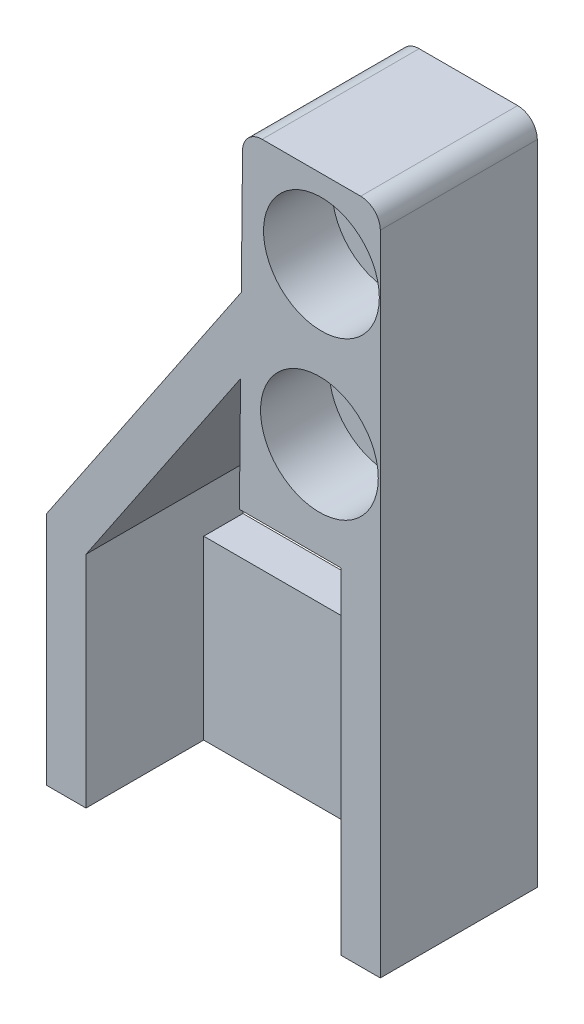
ISO-10303-21;
HEADER;
FILE_DESCRIPTION(('STEP AP214'),'2;1');
FILE_NAME('part.step','',(''),(''),'','','');
FILE_SCHEMA(('AUTOMOTIVE_DESIGN { 1 0 10303 214 1 1 1 1 }'));
ENDSEC;
DATA;
#1=APPLICATION_CONTEXT('core data for automotive mechanical design processes');
#2=APPLICATION_PROTOCOL_DEFINITION('international standard','automotive_design',2000,#1);
#3=PRODUCT_CONTEXT('',#1,'mechanical');
#4=PRODUCT('Part','Part','',(#3));
#5=PRODUCT_RELATED_PRODUCT_CATEGORY('part','',(#4));
#6=PRODUCT_DEFINITION_FORMATION('','',#4);
#7=PRODUCT_DEFINITION_CONTEXT('part definition',#1,'design');
#8=PRODUCT_DEFINITION('design','',#6,#7);
#9=PRODUCT_DEFINITION_SHAPE('','',#8);
#10=(LENGTH_UNIT() NAMED_UNIT(*) SI_UNIT(.MILLI.,.METRE.));
#11=(NAMED_UNIT(*) PLANE_ANGLE_UNIT() SI_UNIT($,.RADIAN.));
#12=(NAMED_UNIT(*) SI_UNIT($,.STERADIAN.) SOLID_ANGLE_UNIT());
#13=UNCERTAINTY_MEASURE_WITH_UNIT(LENGTH_MEASURE(1.E-05),#10,'distance_accuracy_value','');
#14=(GEOMETRIC_REPRESENTATION_CONTEXT(3) GLOBAL_UNCERTAINTY_ASSIGNED_CONTEXT((#13)) GLOBAL_UNIT_ASSIGNED_CONTEXT((#10,
#11,#12)) REPRESENTATION_CONTEXT('',''));
#15=CARTESIAN_POINT('',(0.,0.,0.));
#16=DIRECTION('',(0.,0.,1.));
#17=DIRECTION('',(1.,0.,0.));
#18=AXIS2_PLACEMENT_3D('',#15,#16,#17);
#19=CARTESIAN_POINT('',(3.,30.,8.));
#20=DIRECTION('',(0.,0.,-1.));
#21=DIRECTION('',(-1.,0.,0.));
#22=AXIS2_PLACEMENT_3D('',#19,#20,#21);
#23=CYLINDRICAL_SURFACE('',#22,1.6);
#24=CARTESIAN_POINT('',(3.,30.,0.));
#25=DIRECTION('',(0.,0.,1.));
#26=DIRECTION('',(1.,0.,0.));
#27=AXIS2_PLACEMENT_3D('',#24,#25,#26);
#28=CIRCLE('',#27,1.6);
#29=CARTESIAN_POINT('',(4.6,30.,0.));
#30=VERTEX_POINT('',#29);
#31=EDGE_CURVE('E225',#30,#30,#28,.T.);
#32=ORIENTED_EDGE('',*,*,#31,.F.);
#33=EDGE_LOOP('',(#32));
#34=FACE_BOUND('',#33,.T.);
#35=CARTESIAN_POINT('',(3.,30.,4.5));
#36=DIRECTION('',(0.,0.,1.));
#37=DIRECTION('',(1.,0.,0.));
#38=AXIS2_PLACEMENT_3D('',#35,#36,#37);
#39=CIRCLE('',#38,1.6);
#40=CARTESIAN_POINT('',(4.6,30.,4.5));
#41=VERTEX_POINT('',#40);
#42=EDGE_CURVE('E278',#41,#41,#39,.T.);
#43=ORIENTED_EDGE('',*,*,#42,.T.);
#44=EDGE_LOOP('',(#43));
#45=FACE_BOUND('',#44,.T.);
#46=ADVANCED_FACE('F35',(#34,#45),#23,.F.);
#47=CARTESIAN_POINT('',(2.89726379028041,22.,8.));
#48=DIRECTION('',(0.,0.,-1.));
#49=DIRECTION('',(-1.,0.,0.));
#50=AXIS2_PLACEMENT_3D('',#47,#48,#49);
#51=CYLINDRICAL_SURFACE('',#50,1.6);
#52=CARTESIAN_POINT('',(2.89726379028041,22.,0.));
#53=DIRECTION('',(0.,0.,1.));
#54=DIRECTION('',(1.,0.,0.));
#55=AXIS2_PLACEMENT_3D('',#52,#53,#54);
#56=CIRCLE('',#55,1.6);
#57=CARTESIAN_POINT('',(4.49726379028041,22.,0.));
#58=VERTEX_POINT('',#57);
#59=EDGE_CURVE('E228',#58,#58,#56,.T.);
#60=ORIENTED_EDGE('',*,*,#59,.F.);
#61=EDGE_LOOP('',(#60));
#62=FACE_BOUND('',#61,.T.);
#63=CARTESIAN_POINT('',(2.89726379028041,22.,4.5));
#64=DIRECTION('',(0.,0.,1.));
#65=DIRECTION('',(1.,0.,0.));
#66=AXIS2_PLACEMENT_3D('',#63,#64,#65);
#67=CIRCLE('',#66,1.6);
#68=CARTESIAN_POINT('',(4.49726379028041,22.,4.5));
#69=VERTEX_POINT('',#68);
#70=EDGE_CURVE('E186',#69,#69,#67,.T.);
#71=ORIENTED_EDGE('',*,*,#70,.T.);
#72=EDGE_LOOP('',(#71));
#73=FACE_BOUND('',#72,.T.);
#74=ADVANCED_FACE('F331',(#62,#73),#51,.F.);
#75=CARTESIAN_POINT('',(-1.01055642635325,34.0034369178317,8.));
#76=DIRECTION('',(0.999950142321506,-0.00998563323976393,0.));
#77=DIRECTION('',(0.00998563323976393,0.999950142321506,0.));
#78=AXIS2_PLACEMENT_3D('',#75,#76,#77);
#79=PLANE('',#78);
#80=DIRECTION('',(-0.00998563323976393,-0.999950142321506,0.));
#81=VECTOR('',#80,1.);
#82=CARTESIAN_POINT('',(-1.01055642635325,34.0034369178317,8.));
#83=LINE('',#82,#81);
#84=CARTESIAN_POINT('',(-1.02044283963543,33.0134225510715,8.));
#85=VERTEX_POINT('',#84);
#86=CARTESIAN_POINT('',(-1.08330823355803,26.7181523272791,8.));
#87=VERTEX_POINT('',#86);
#88=EDGE_CURVE('E241',#85,#87,#83,.T.);
#89=ORIENTED_EDGE('',*,*,#88,.F.);
#90=DIRECTION('',(0.,0.,-1.));
#91=VECTOR('',#90,1.);
#92=CARTESIAN_POINT('',(-1.02044283963543,33.0134225510715,8.));
#93=LINE('',#92,#91);
#94=CARTESIAN_POINT('',(-1.02044283963543,33.0134225510715,0.));
#95=VERTEX_POINT('',#94);
#96=EDGE_CURVE('E11',#85,#95,#93,.T.);
#97=ORIENTED_EDGE('',*,*,#96,.T.);
#98=DIRECTION('',(-0.00998563323976393,-0.999950142321506,0.));
#99=VECTOR('',#98,1.);
#100=CARTESIAN_POINT('',(-1.01055642635325,34.0034369178317,0.));
#101=LINE('',#100,#99);
#102=CARTESIAN_POINT('',(-1.08330823355803,26.7181523272791,0.));
#103=VERTEX_POINT('',#102);
#104=EDGE_CURVE('E253',#95,#103,#101,.T.);
#105=ORIENTED_EDGE('',*,*,#104,.T.);
#106=DIRECTION('',(0.,0.,1.));
#107=VECTOR('',#106,1.);
#108=CARTESIAN_POINT('',(-1.08330823355803,26.7181523272791,0.));
#109=LINE('',#108,#107);
#110=EDGE_CURVE('E192',#103,#87,#109,.T.);
#111=ORIENTED_EDGE('',*,*,#110,.T.);
#112=EDGE_LOOP('',(#89,#97,#105,#111));
#113=FACE_BOUND('',#112,.T.);
#114=ADVANCED_FACE('F322',(#113),#79,.F.);
#115=CARTESIAN_POINT('',(0.,0.,8.));
#116=DIRECTION('',(0.,0.,-1.));
#117=DIRECTION('',(-1.,0.,0.));
#118=AXIS2_PLACEMENT_3D('',#115,#116,#117);
#119=PLANE('',#118);
#120=CARTESIAN_POINT('',(3.,30.,8.));
#121=DIRECTION('',(0.,0.,1.));
#122=DIRECTION('',(1.,0.,0.));
#123=AXIS2_PLACEMENT_3D('',#120,#121,#122);
#124=CIRCLE('',#123,2.95);
#125=CARTESIAN_POINT('',(5.95,30.,8.));
#126=VERTEX_POINT('',#125);
#127=EDGE_CURVE('E555',#126,#126,#124,.T.);
#128=ORIENTED_EDGE('',*,*,#127,.F.);
#129=EDGE_LOOP('',(#128));
#130=FACE_BOUND('',#129,.T.);
#131=CARTESIAN_POINT('',(2.89726379028041,22.,8.));
#132=DIRECTION('',(0.,0.,1.));
#133=DIRECTION('',(1.,0.,0.));
#134=AXIS2_PLACEMENT_3D('',#131,#132,#133);
#135=CIRCLE('',#134,3.);
#136=CARTESIAN_POINT('',(5.89726379028042,22.,8.));
#137=VERTEX_POINT('',#136);
#138=EDGE_CURVE('E181',#137,#137,#135,.T.);
#139=ORIENTED_EDGE('',*,*,#138,.F.);
#140=EDGE_LOOP('',(#139));
#141=FACE_BOUND('',#140,.T.);
#142=DIRECTION('',(0.,1.,0.));
#143=VECTOR('',#142,1.);
#144=CARTESIAN_POINT('',(6.,0.,8.));
#145=LINE('',#144,#143);
#146=CARTESIAN_POINT('',(6.,0.,8.));
#147=VERTEX_POINT('',#146);
#148=CARTESIAN_POINT('',(6.,33.0034369178317,8.));
#149=VERTEX_POINT('',#148);
#150=EDGE_CURVE('E235',#147,#149,#145,.T.);
#151=ORIENTED_EDGE('',*,*,#150,.T.);
#152=CARTESIAN_POINT('',(5.,33.0034369178317,8.));
#153=DIRECTION('',(0.,0.,-1.));
#154=DIRECTION('',(-1.,0.,0.));
#155=AXIS2_PLACEMENT_3D('',#152,#153,#154);
#156=CIRCLE('',#155,1.);
#157=CARTESIAN_POINT('',(5.,34.0034369178317,8.));
#158=VERTEX_POINT('',#157);
#159=EDGE_CURVE('E43',#149,#158,#156,.F.);
#160=ORIENTED_EDGE('',*,*,#159,.T.);
#161=DIRECTION('',(-1.,0.,0.));
#162=VECTOR('',#161,1.);
#163=CARTESIAN_POINT('',(0.,34.0034369178317,8.));
#164=LINE('',#163,#162);
#165=CARTESIAN_POINT('',(-0.0204926973139273,34.0034369178317,8.));
#166=VERTEX_POINT('',#165);
#167=EDGE_CURVE('E238',#158,#166,#164,.T.);
#168=ORIENTED_EDGE('',*,*,#167,.T.);
#169=CARTESIAN_POINT('',(-0.0204926973139273,33.0034369178317,8.));
#170=DIRECTION('',(0.,0.,-1.));
#171=DIRECTION('',(-1.,0.,0.));
#172=AXIS2_PLACEMENT_3D('',#169,#170,#171);
#173=CIRCLE('',#172,1.);
#174=EDGE_CURVE('E50',#166,#85,#173,.F.);
#175=ORIENTED_EDGE('',*,*,#174,.T.);
#176=ORIENTED_EDGE('',*,*,#88,.T.);
#177=DIRECTION('',(-0.558773518467853,-0.829320297025857,0.));
#178=VECTOR('',#177,1.);
#179=CARTESIAN_POINT('',(-11.,12.,8.));
#180=LINE('',#179,#178);
#181=CARTESIAN_POINT('',(-11.,12.,8.));
#182=VERTEX_POINT('',#181);
#183=EDGE_CURVE('E176',#87,#182,#180,.T.);
#184=ORIENTED_EDGE('',*,*,#183,.T.);
#185=DIRECTION('',(0.,-1.,0.));
#186=VECTOR('',#185,1.);
#187=CARTESIAN_POINT('',(-11.,0.,8.));
#188=LINE('',#187,#186);
#189=CARTESIAN_POINT('',(-11.,0.,8.));
#190=VERTEX_POINT('',#189);
#191=EDGE_CURVE('E243',#182,#190,#188,.T.);
#192=ORIENTED_EDGE('',*,*,#191,.T.);
#193=DIRECTION('',(1.,0.,0.));
#194=VECTOR('',#193,1.);
#195=CARTESIAN_POINT('',(0.,0.,8.));
#196=LINE('',#195,#194);
#197=CARTESIAN_POINT('',(-8.99817146185961,0.,8.));
#198=VERTEX_POINT('',#197);
#199=EDGE_CURVE('E232',#190,#198,#196,.T.);
#200=ORIENTED_EDGE('',*,*,#199,.T.);
#201=DIRECTION('',(0.,-1.,0.));
#202=VECTOR('',#201,1.);
#203=CARTESIAN_POINT('',(-8.99817146185961,0.,8.));
#204=LINE('',#203,#202);
#205=CARTESIAN_POINT('',(-8.99817146185961,11.2012197421227,8.));
#206=VERTEX_POINT('',#205);
#207=EDGE_CURVE('E191',#206,#198,#204,.T.);
#208=ORIENTED_EDGE('',*,*,#207,.F.);
#209=DIRECTION('',(0.558773518467853,0.829320297025858,0.));
#210=VECTOR('',#209,1.);
#211=CARTESIAN_POINT('',(-1.12152084193054,22.8915844709306,8.));
#212=LINE('',#211,#210);
#213=CARTESIAN_POINT('',(-1.12152084193054,22.8915844709306,8.));
#214=VERTEX_POINT('',#213);
#215=EDGE_CURVE('E157',#206,#214,#212,.T.);
#216=ORIENTED_EDGE('',*,*,#215,.T.);
#217=CARTESIAN_POINT('',(-1.17940341998797,17.0952878539086,8.));
#218=VERTEX_POINT('',#217);
#219=EDGE_CURVE('E240',#214,#218,#83,.T.);
#220=ORIENTED_EDGE('',*,*,#219,.T.);
#221=DIRECTION('',(-1.,0.,0.));
#222=VECTOR('',#221,1.);
#223=CARTESIAN_POINT('',(-8.99817146185961,17.0952878539086,8.));
#224=LINE('',#223,#222);
#225=CARTESIAN_POINT('',(4.00182853814039,17.0952878539086,8.));
#226=VERTEX_POINT('',#225);
#227=EDGE_CURVE('E200',#226,#218,#224,.T.);
#228=ORIENTED_EDGE('',*,*,#227,.F.);
#229=DIRECTION('',(0.,1.,0.));
#230=VECTOR('',#229,1.);
#231=CARTESIAN_POINT('',(4.00182853814039,0.,8.));
#232=LINE('',#231,#230);
#233=CARTESIAN_POINT('',(4.00182853814039,0.,8.));
#234=VERTEX_POINT('',#233);
#235=EDGE_CURVE('E211',#234,#226,#232,.T.);
#236=ORIENTED_EDGE('',*,*,#235,.F.);
#237=EDGE_CURVE('E236',#234,#147,#196,.T.);
#238=ORIENTED_EDGE('',*,*,#237,.T.);
#239=EDGE_LOOP('',(#151,#160,#168,#175,#176,#184,#192,#200,#208,#216,#220,#228,#236,#238));
#240=FACE_BOUND('',#239,.T.);
#241=ADVANCED_FACE('F293',(#130,#141,#240),#119,.F.);
#242=CARTESIAN_POINT('',(0.,0.,0.));
#243=DIRECTION('',(0.,0.,-1.));
#244=DIRECTION('',(-1.,0.,0.));
#245=AXIS2_PLACEMENT_3D('',#242,#243,#244);
#246=PLANE('',#245);
#247=DIRECTION('',(-1.,0.,0.));
#248=VECTOR('',#247,1.);
#249=CARTESIAN_POINT('',(0.,34.0034369178317,0.));
#250=LINE('',#249,#248);
#251=CARTESIAN_POINT('',(5.,34.0034369178317,0.));
#252=VERTEX_POINT('',#251);
#253=CARTESIAN_POINT('',(-0.0204926973139273,34.0034369178317,0.));
#254=VERTEX_POINT('',#253);
#255=EDGE_CURVE('E250',#252,#254,#250,.T.);
#256=ORIENTED_EDGE('',*,*,#255,.F.);
#257=CARTESIAN_POINT('',(5.,33.0034369178317,0.));
#258=DIRECTION('',(0.,0.,-1.));
#259=DIRECTION('',(-1.,0.,0.));
#260=AXIS2_PLACEMENT_3D('',#257,#258,#259);
#261=CIRCLE('',#260,1.);
#262=CARTESIAN_POINT('',(6.,33.0034369178317,0.));
#263=VERTEX_POINT('',#262);
#264=EDGE_CURVE('E288',#252,#263,#261,.T.);
#265=ORIENTED_EDGE('',*,*,#264,.T.);
#266=DIRECTION('',(0.,1.,0.));
#267=VECTOR('',#266,1.);
#268=CARTESIAN_POINT('',(6.,24.,0.));
#269=LINE('',#268,#267);
#270=CARTESIAN_POINT('',(6.,0.,0.));
#271=VERTEX_POINT('',#270);
#272=EDGE_CURVE('E248',#271,#263,#269,.T.);
#273=ORIENTED_EDGE('',*,*,#272,.F.);
#274=DIRECTION('',(1.,0.,0.));
#275=VECTOR('',#274,1.);
#276=CARTESIAN_POINT('',(0.,0.,0.));
#277=LINE('',#276,#275);
#278=CARTESIAN_POINT('',(-11.,0.,0.));
#279=VERTEX_POINT('',#278);
#280=EDGE_CURVE('E231',#279,#271,#277,.T.);
#281=ORIENTED_EDGE('',*,*,#280,.F.);
#282=DIRECTION('',(0.,-1.,0.));
#283=VECTOR('',#282,1.);
#284=CARTESIAN_POINT('',(-11.,0.,0.));
#285=LINE('',#284,#283);
#286=CARTESIAN_POINT('',(-11.,12.,0.));
#287=VERTEX_POINT('',#286);
#288=EDGE_CURVE('E257',#287,#279,#285,.T.);
#289=ORIENTED_EDGE('',*,*,#288,.F.);
#290=DIRECTION('',(-0.558773518467853,-0.829320297025857,0.));
#291=VECTOR('',#290,1.);
#292=CARTESIAN_POINT('',(-11.,12.,0.));
#293=LINE('',#292,#291);
#294=EDGE_CURVE('E171',#103,#287,#293,.T.);
#295=ORIENTED_EDGE('',*,*,#294,.F.);
#296=ORIENTED_EDGE('',*,*,#104,.F.);
#297=CARTESIAN_POINT('',(-0.0204926973139273,33.0034369178317,0.));
#298=DIRECTION('',(0.,0.,-1.));
#299=DIRECTION('',(-1.,0.,0.));
#300=AXIS2_PLACEMENT_3D('',#297,#298,#299);
#301=CIRCLE('',#300,1.);
#302=EDGE_CURVE('E286',#95,#254,#301,.T.);
#303=ORIENTED_EDGE('',*,*,#302,.T.);
#304=EDGE_LOOP('',(#256,#265,#273,#281,#289,#295,#296,#303));
#305=FACE_BOUND('',#304,.T.);
#306=ORIENTED_EDGE('',*,*,#59,.T.);
#307=EDGE_LOOP('',(#306));
#308=FACE_BOUND('',#307,.T.);
#309=CARTESIAN_POINT('',(-1.12152084193054,22.8915844709306,0.));
#310=VERTEX_POINT('',#309);
#311=CARTESIAN_POINT('',(-1.26024402599236,9.,0.));
#312=VERTEX_POINT('',#311);
#313=EDGE_CURVE('E170',#310,#312,#101,.T.);
#314=ORIENTED_EDGE('',*,*,#313,.F.);
#315=DIRECTION('',(0.558773518467853,0.829320297025858,0.));
#316=VECTOR('',#315,1.);
#317=CARTESIAN_POINT('',(-1.12152084193054,22.8915844709306,0.));
#318=LINE('',#317,#316);
#319=CARTESIAN_POINT('',(-8.99817146185961,11.2012197421227,0.));
#320=VERTEX_POINT('',#319);
#321=EDGE_CURVE('E155',#320,#310,#318,.T.);
#322=ORIENTED_EDGE('',*,*,#321,.F.);
#323=DIRECTION('',(0.,1.,0.));
#324=VECTOR('',#323,1.);
#325=CARTESIAN_POINT('',(-8.99817146185961,9.,0.));
#326=LINE('',#325,#324);
#327=CARTESIAN_POINT('',(-8.99817146185961,9.,0.));
#328=VERTEX_POINT('',#327);
#329=EDGE_CURVE('E169',#328,#320,#326,.T.);
#330=ORIENTED_EDGE('',*,*,#329,.F.);
#331=DIRECTION('',(-1.,0.,0.));
#332=VECTOR('',#331,1.);
#333=CARTESIAN_POINT('',(-1.26024402599236,9.,0.));
#334=LINE('',#333,#332);
#335=EDGE_CURVE('E255',#312,#328,#334,.T.);
#336=ORIENTED_EDGE('',*,*,#335,.F.);
#337=EDGE_LOOP('',(#314,#322,#330,#336));
#338=FACE_BOUND('',#337,.T.);
#339=ORIENTED_EDGE('',*,*,#31,.T.);
#340=EDGE_LOOP('',(#339));
#341=FACE_BOUND('',#340,.T.);
#342=ADVANCED_FACE('F166',(#305,#308,#338,#341),#246,.T.);
#343=CARTESIAN_POINT('',(0.,0.,8.));
#344=DIRECTION('',(0.,1.,0.));
#345=DIRECTION('',(0.,0.,1.));
#346=AXIS2_PLACEMENT_3D('',#343,#344,#345);
#347=PLANE('',#346);
#348=DIRECTION('',(1.,0.,0.));
#349=VECTOR('',#348,1.);
#350=CARTESIAN_POINT('',(-8.99817146185961,0.,2.));
#351=LINE('',#350,#349);
#352=CARTESIAN_POINT('',(-8.99817146185961,0.,2.));
#353=VERTEX_POINT('',#352);
#354=CARTESIAN_POINT('',(4.00182853814039,0.,2.));
#355=VERTEX_POINT('',#354);
#356=EDGE_CURVE('E199',#353,#355,#351,.T.);
#357=ORIENTED_EDGE('',*,*,#356,.F.);
#358=DIRECTION('',(0.,0.,1.));
#359=VECTOR('',#358,1.);
#360=CARTESIAN_POINT('',(-8.99817146185961,0.,2.));
#361=LINE('',#360,#359);
#362=EDGE_CURVE('E209',#353,#198,#361,.T.);
#363=ORIENTED_EDGE('',*,*,#362,.T.);
#364=ORIENTED_EDGE('',*,*,#199,.F.);
#365=DIRECTION('',(0.,0.,-1.));
#366=VECTOR('',#365,1.);
#367=CARTESIAN_POINT('',(-11.,0.,8.));
#368=LINE('',#367,#366);
#369=EDGE_CURVE('E245',#190,#279,#368,.T.);
#370=ORIENTED_EDGE('',*,*,#369,.T.);
#371=ORIENTED_EDGE('',*,*,#280,.T.);
#372=DIRECTION('',(0.,0.,-1.));
#373=VECTOR('',#372,1.);
#374=CARTESIAN_POINT('',(6.,0.,8.));
#375=LINE('',#374,#373);
#376=EDGE_CURVE('E265',#147,#271,#375,.T.);
#377=ORIENTED_EDGE('',*,*,#376,.F.);
#378=ORIENTED_EDGE('',*,*,#237,.F.);
#379=DIRECTION('',(0.,0.,1.));
#380=VECTOR('',#379,1.);
#381=CARTESIAN_POINT('',(4.00182853814039,0.,2.));
#382=LINE('',#381,#380);
#383=EDGE_CURVE('E219',#355,#234,#382,.T.);
#384=ORIENTED_EDGE('',*,*,#383,.F.);
#385=EDGE_LOOP('',(#357,#363,#364,#370,#371,#377,#378,#384));
#386=FACE_BOUND('',#385,.T.);
#387=ADVANCED_FACE('F308',(#386),#347,.F.);
#388=CARTESIAN_POINT('',(6.,24.,8.));
#389=DIRECTION('',(-1.,0.,0.));
#390=DIRECTION('',(0.,0.,1.));
#391=AXIS2_PLACEMENT_3D('',#388,#389,#390);
#392=PLANE('',#391);
#393=ORIENTED_EDGE('',*,*,#272,.T.);
#394=DIRECTION('',(0.,0.,-1.));
#395=VECTOR('',#394,1.);
#396=CARTESIAN_POINT('',(6.,33.0034369178317,8.));
#397=LINE('',#396,#395);
#398=EDGE_CURVE('E58',#263,#149,#397,.F.);
#399=ORIENTED_EDGE('',*,*,#398,.T.);
#400=ORIENTED_EDGE('',*,*,#150,.F.);
#401=ORIENTED_EDGE('',*,*,#376,.T.);
#402=EDGE_LOOP('',(#393,#399,#400,#401));
#403=FACE_BOUND('',#402,.T.);
#404=ADVANCED_FACE('F303',(#403),#392,.F.);
#405=CARTESIAN_POINT('',(0.,34.0034369178317,8.));
#406=DIRECTION('',(0.,-1.,0.));
#407=DIRECTION('',(0.,0.,-1.));
#408=AXIS2_PLACEMENT_3D('',#405,#406,#407);
#409=PLANE('',#408);
#410=ORIENTED_EDGE('',*,*,#167,.F.);
#411=DIRECTION('',(0.,0.,-1.));
#412=VECTOR('',#411,1.);
#413=CARTESIAN_POINT('',(5.,34.0034369178317,8.));
#414=LINE('',#413,#412);
#415=EDGE_CURVE('E283',#158,#252,#414,.T.);
#416=ORIENTED_EDGE('',*,*,#415,.T.);
#417=ORIENTED_EDGE('',*,*,#255,.T.);
#418=DIRECTION('',(0.,0.,-1.));
#419=VECTOR('',#418,1.);
#420=CARTESIAN_POINT('',(-0.0204926973139273,34.0034369178317,8.));
#421=LINE('',#420,#419);
#422=EDGE_CURVE('E274',#254,#166,#421,.F.);
#423=ORIENTED_EDGE('',*,*,#422,.T.);
#424=EDGE_LOOP('',(#410,#416,#417,#423));
#425=FACE_BOUND('',#424,.T.);
#426=ADVANCED_FACE('F297',(#425),#409,.F.);
#427=ORIENTED_EDGE('',*,*,#219,.F.);
#428=DIRECTION('',(0.,0.,1.));
#429=VECTOR('',#428,1.);
#430=CARTESIAN_POINT('',(-1.12152084193054,22.8915844709306,0.));
#431=LINE('',#430,#429);
#432=EDGE_CURVE('E160',#310,#214,#431,.T.);
#433=ORIENTED_EDGE('',*,*,#432,.F.);
#434=ORIENTED_EDGE('',*,*,#313,.T.);
#435=DIRECTION('',(0.,0.,-1.));
#436=VECTOR('',#435,1.);
#437=CARTESIAN_POINT('',(-1.26024402599236,9.,8.));
#438=LINE('',#437,#436);
#439=CARTESIAN_POINT('',(-1.26024402599236,9.,2.));
#440=VERTEX_POINT('',#439);
#441=EDGE_CURVE('E262',#440,#312,#438,.T.);
#442=ORIENTED_EDGE('',*,*,#441,.F.);
#443=DIRECTION('',(0.00998563323976393,0.999950142321506,0.));
#444=VECTOR('',#443,1.);
#445=CARTESIAN_POINT('',(-1.01055642635325,34.0034369178317,2.));
#446=LINE('',#445,#444);
#447=CARTESIAN_POINT('',(-1.17940341998797,17.0952878539086,2.));
#448=VERTEX_POINT('',#447);
#449=EDGE_CURVE('E218',#440,#448,#446,.T.);
#450=ORIENTED_EDGE('',*,*,#449,.T.);
#451=DIRECTION('',(0.,0.,1.));
#452=VECTOR('',#451,1.);
#453=CARTESIAN_POINT('',(-1.17940341998797,17.0952878539086,8.));
#454=LINE('',#453,#452);
#455=EDGE_CURVE('E271',#448,#218,#454,.T.);
#456=ORIENTED_EDGE('',*,*,#455,.T.);
#457=EDGE_LOOP('',(#427,#433,#434,#442,#450,#456));
#458=FACE_BOUND('',#457,.T.);
#459=ADVANCED_FACE('F355',(#458),#79,.F.);
#460=CARTESIAN_POINT('',(-1.26024402599236,9.,8.));
#461=DIRECTION('',(0.,-1.,0.));
#462=DIRECTION('',(1.,0.,0.));
#463=AXIS2_PLACEMENT_3D('',#460,#461,#462);
#464=PLANE('',#463);
#465=ORIENTED_EDGE('',*,*,#335,.T.);
#466=DIRECTION('',(0.,0.,1.));
#467=VECTOR('',#466,1.);
#468=CARTESIAN_POINT('',(-8.99817146185961,9.,0.));
#469=LINE('',#468,#467);
#470=CARTESIAN_POINT('',(-8.99817146185961,9.,2.));
#471=VERTEX_POINT('',#470);
#472=EDGE_CURVE('E161',#328,#471,#469,.T.);
#473=ORIENTED_EDGE('',*,*,#472,.T.);
#474=DIRECTION('',(1.,0.,0.));
#475=VECTOR('',#474,1.);
#476=CARTESIAN_POINT('',(-1.26024402599236,9.,2.));
#477=LINE('',#476,#475);
#478=EDGE_CURVE('E268',#471,#440,#477,.T.);
#479=ORIENTED_EDGE('',*,*,#478,.T.);
#480=ORIENTED_EDGE('',*,*,#441,.T.);
#481=EDGE_LOOP('',(#465,#473,#479,#480));
#482=FACE_BOUND('',#481,.T.);
#483=ADVANCED_FACE('F352',(#482),#464,.F.);
#484=CARTESIAN_POINT('',(-11.,0.,8.));
#485=DIRECTION('',(1.,0.,0.));
#486=DIRECTION('',(0.,0.,-1.));
#487=AXIS2_PLACEMENT_3D('',#484,#485,#486);
#488=PLANE('',#487);
#489=ORIENTED_EDGE('',*,*,#288,.T.);
#490=ORIENTED_EDGE('',*,*,#369,.F.);
#491=ORIENTED_EDGE('',*,*,#191,.F.);
#492=DIRECTION('',(0.,0.,1.));
#493=VECTOR('',#492,1.);
#494=CARTESIAN_POINT('',(-11.,12.,0.));
#495=LINE('',#494,#493);
#496=EDGE_CURVE('E188',#287,#182,#495,.T.);
#497=ORIENTED_EDGE('',*,*,#496,.F.);
#498=EDGE_LOOP('',(#489,#490,#491,#497));
#499=FACE_BOUND('',#498,.T.);
#500=ADVANCED_FACE('F315',(#499),#488,.F.);
#501=CARTESIAN_POINT('',(-8.99817146185961,17.0952878539086,2.));
#502=DIRECTION('',(0.,1.,0.));
#503=DIRECTION('',(0.,0.,1.));
#504=AXIS2_PLACEMENT_3D('',#501,#502,#503);
#505=PLANE('',#504);
#506=DIRECTION('',(-1.,0.,0.));
#507=VECTOR('',#506,1.);
#508=CARTESIAN_POINT('',(-8.99817146185961,17.0952878539086,2.));
#509=LINE('',#508,#507);
#510=CARTESIAN_POINT('',(4.00182853814039,17.0952878539086,2.));
#511=VERTEX_POINT('',#510);
#512=EDGE_CURVE('E206',#511,#448,#509,.T.);
#513=ORIENTED_EDGE('',*,*,#512,.F.);
#514=DIRECTION('',(0.,0.,1.));
#515=VECTOR('',#514,1.);
#516=CARTESIAN_POINT('',(4.00182853814039,17.0952878539086,2.));
#517=LINE('',#516,#515);
#518=EDGE_CURVE('E216',#511,#226,#517,.T.);
#519=ORIENTED_EDGE('',*,*,#518,.T.);
#520=ORIENTED_EDGE('',*,*,#227,.T.);
#521=ORIENTED_EDGE('',*,*,#455,.F.);
#522=EDGE_LOOP('',(#513,#519,#520,#521));
#523=FACE_BOUND('',#522,.T.);
#524=ADVANCED_FACE('F351',(#523),#505,.F.);
#525=CARTESIAN_POINT('',(-8.99817146185961,0.,2.));
#526=DIRECTION('',(-1.,0.,0.));
#527=DIRECTION('',(0.,0.,1.));
#528=AXIS2_PLACEMENT_3D('',#525,#526,#527);
#529=PLANE('',#528);
#530=ORIENTED_EDGE('',*,*,#207,.T.);
#531=ORIENTED_EDGE('',*,*,#362,.F.);
#532=DIRECTION('',(0.,-1.,0.));
#533=VECTOR('',#532,1.);
#534=CARTESIAN_POINT('',(-8.99817146185961,0.,2.));
#535=LINE('',#534,#533);
#536=EDGE_CURVE('E197',#471,#353,#535,.T.);
#537=ORIENTED_EDGE('',*,*,#536,.F.);
#538=ORIENTED_EDGE('',*,*,#472,.F.);
#539=ORIENTED_EDGE('',*,*,#329,.T.);
#540=DIRECTION('',(0.,0.,1.));
#541=VECTOR('',#540,1.);
#542=CARTESIAN_POINT('',(-8.99817146185961,11.2012197421227,0.));
#543=LINE('',#542,#541);
#544=EDGE_CURVE('E151',#320,#206,#543,.T.);
#545=ORIENTED_EDGE('',*,*,#544,.T.);
#546=EDGE_LOOP('',(#530,#531,#537,#538,#539,#545));
#547=FACE_BOUND('',#546,.T.);
#548=ADVANCED_FACE('F174',(#547),#529,.F.);
#549=CARTESIAN_POINT('',(0.,0.,2.));
#550=DIRECTION('',(0.,0.,-1.));
#551=DIRECTION('',(-1.,0.,0.));
#552=AXIS2_PLACEMENT_3D('',#549,#550,#551);
#553=PLANE('',#552);
#554=ORIENTED_EDGE('',*,*,#478,.F.);
#555=ORIENTED_EDGE('',*,*,#536,.T.);
#556=ORIENTED_EDGE('',*,*,#356,.T.);
#557=DIRECTION('',(0.,1.,0.));
#558=VECTOR('',#557,1.);
#559=CARTESIAN_POINT('',(4.00182853814039,0.,2.));
#560=LINE('',#559,#558);
#561=EDGE_CURVE('E203',#355,#511,#560,.T.);
#562=ORIENTED_EDGE('',*,*,#561,.T.);
#563=ORIENTED_EDGE('',*,*,#512,.T.);
#564=ORIENTED_EDGE('',*,*,#449,.F.);
#565=EDGE_LOOP('',(#554,#555,#556,#562,#563,#564));
#566=FACE_BOUND('',#565,.T.);
#567=ADVANCED_FACE('F405',(#566),#553,.F.);
#568=CARTESIAN_POINT('',(4.00182853814039,0.,2.));
#569=DIRECTION('',(1.,0.,0.));
#570=DIRECTION('',(0.,0.,-1.));
#571=AXIS2_PLACEMENT_3D('',#568,#569,#570);
#572=PLANE('',#571);
#573=ORIENTED_EDGE('',*,*,#235,.T.);
#574=ORIENTED_EDGE('',*,*,#518,.F.);
#575=ORIENTED_EDGE('',*,*,#561,.F.);
#576=ORIENTED_EDGE('',*,*,#383,.T.);
#577=EDGE_LOOP('',(#573,#574,#575,#576));
#578=FACE_BOUND('',#577,.T.);
#579=ADVANCED_FACE('F411',(#578),#572,.F.);
#580=CARTESIAN_POINT('',(-11.,12.,0.));
#581=DIRECTION('',(-0.829320297025857,0.558773518467853,0.));
#582=DIRECTION('',(-0.558773518467853,-0.829320297025857,0.));
#583=AXIS2_PLACEMENT_3D('',#580,#581,#582);
#584=PLANE('',#583);
#585=ORIENTED_EDGE('',*,*,#183,.F.);
#586=ORIENTED_EDGE('',*,*,#110,.F.);
#587=ORIENTED_EDGE('',*,*,#294,.T.);
#588=ORIENTED_EDGE('',*,*,#496,.T.);
#589=EDGE_LOOP('',(#585,#586,#587,#588));
#590=FACE_BOUND('',#589,.T.);
#591=ADVANCED_FACE('F319',(#590),#584,.T.);
#592=CARTESIAN_POINT('',(-1.12152084193054,22.8915844709306,0.));
#593=DIRECTION('',(0.829320297025858,-0.558773518467853,0.));
#594=DIRECTION('',(0.558773518467853,0.829320297025858,0.));
#595=AXIS2_PLACEMENT_3D('',#592,#593,#594);
#596=PLANE('',#595);
#597=ORIENTED_EDGE('',*,*,#215,.F.);
#598=ORIENTED_EDGE('',*,*,#544,.F.);
#599=ORIENTED_EDGE('',*,*,#321,.T.);
#600=ORIENTED_EDGE('',*,*,#432,.T.);
#601=EDGE_LOOP('',(#597,#598,#599,#600));
#602=FACE_BOUND('',#601,.T.);
#603=ADVANCED_FACE('F153',(#602),#596,.T.);
#604=CARTESIAN_POINT('',(2.89726379028041,22.,4.5));
#605=DIRECTION('',(0.,0.,1.));
#606=DIRECTION('',(1.,0.,0.));
#607=AXIS2_PLACEMENT_3D('',#604,#605,#606);
#608=CYLINDRICAL_SURFACE('',#607,3.);
#609=CARTESIAN_POINT('',(2.89726379028041,22.,4.5));
#610=DIRECTION('',(0.,0.,1.));
#611=DIRECTION('',(1.,0.,0.));
#612=AXIS2_PLACEMENT_3D('',#609,#610,#611);
#613=CIRCLE('',#612,3.);
#614=CARTESIAN_POINT('',(5.89726379028042,22.,4.5));
#615=VERTEX_POINT('',#614);
#616=EDGE_CURVE('E277',#615,#615,#613,.T.);
#617=ORIENTED_EDGE('',*,*,#616,.F.);
#618=EDGE_LOOP('',(#617));
#619=FACE_BOUND('',#618,.T.);
#620=ORIENTED_EDGE('',*,*,#138,.T.);
#621=EDGE_LOOP('',(#620));
#622=FACE_BOUND('',#621,.T.);
#623=ADVANCED_FACE('F429',(#619,#622),#608,.F.);
#624=CARTESIAN_POINT('',(2.89726379028041,22.,4.5));
#625=DIRECTION('',(0.,0.,1.));
#626=DIRECTION('',(1.,0.,0.));
#627=AXIS2_PLACEMENT_3D('',#624,#625,#626);
#628=PLANE('',#627);
#629=ORIENTED_EDGE('',*,*,#70,.F.);
#630=EDGE_LOOP('',(#629));
#631=FACE_BOUND('',#630,.T.);
#632=ORIENTED_EDGE('',*,*,#616,.T.);
#633=EDGE_LOOP('',(#632));
#634=FACE_BOUND('',#633,.T.);
#635=ADVANCED_FACE('F436',(#631,#634),#628,.T.);
#636=CARTESIAN_POINT('',(3.,30.,4.5));
#637=DIRECTION('',(0.,0.,1.));
#638=DIRECTION('',(1.,0.,0.));
#639=AXIS2_PLACEMENT_3D('',#636,#637,#638);
#640=CYLINDRICAL_SURFACE('',#639,2.95);
#641=CARTESIAN_POINT('',(3.,30.,4.5));
#642=DIRECTION('',(0.,0.,1.));
#643=DIRECTION('',(1.,0.,0.));
#644=AXIS2_PLACEMENT_3D('',#641,#642,#643);
#645=CIRCLE('',#644,2.95);
#646=CARTESIAN_POINT('',(5.95,30.,4.5));
#647=VERTEX_POINT('',#646);
#648=EDGE_CURVE('E281',#647,#647,#645,.T.);
#649=ORIENTED_EDGE('',*,*,#648,.F.);
#650=EDGE_LOOP('',(#649));
#651=FACE_BOUND('',#650,.T.);
#652=ORIENTED_EDGE('',*,*,#127,.T.);
#653=EDGE_LOOP('',(#652));
#654=FACE_BOUND('',#653,.T.);
#655=ADVANCED_FACE('F445',(#651,#654),#640,.F.);
#656=CARTESIAN_POINT('',(3.,30.,4.5));
#657=DIRECTION('',(0.,0.,1.));
#658=DIRECTION('',(1.,0.,0.));
#659=AXIS2_PLACEMENT_3D('',#656,#657,#658);
#660=PLANE('',#659);
#661=ORIENTED_EDGE('',*,*,#42,.F.);
#662=EDGE_LOOP('',(#661));
#663=FACE_BOUND('',#662,.T.);
#664=ORIENTED_EDGE('',*,*,#648,.T.);
#665=EDGE_LOOP('',(#664));
#666=FACE_BOUND('',#665,.T.);
#667=ADVANCED_FACE('F329',(#663,#666),#660,.T.);
#668=CARTESIAN_POINT('',(5.,33.0034369178317,8.));
#669=DIRECTION('',(0.,0.,-1.));
#670=DIRECTION('',(-1.,0.,0.));
#671=AXIS2_PLACEMENT_3D('',#668,#669,#670);
#672=CYLINDRICAL_SURFACE('',#671,1.);
#673=ORIENTED_EDGE('',*,*,#159,.F.);
#674=ORIENTED_EDGE('',*,*,#398,.F.);
#675=ORIENTED_EDGE('',*,*,#264,.F.);
#676=ORIENTED_EDGE('',*,*,#415,.F.);
#677=EDGE_LOOP('',(#673,#674,#675,#676));
#678=FACE_BOUND('',#677,.T.);
#679=ADVANCED_FACE('F300',(#678),#672,.T.);
#680=CARTESIAN_POINT('',(-0.0204926973139273,33.0034369178317,8.));
#681=DIRECTION('',(0.,0.,-1.));
#682=DIRECTION('',(-1.,0.,0.));
#683=AXIS2_PLACEMENT_3D('',#680,#681,#682);
#684=CYLINDRICAL_SURFACE('',#683,1.);
#685=ORIENTED_EDGE('',*,*,#174,.F.);
#686=ORIENTED_EDGE('',*,*,#422,.F.);
#687=ORIENTED_EDGE('',*,*,#302,.F.);
#688=ORIENTED_EDGE('',*,*,#96,.F.);
#689=EDGE_LOOP('',(#685,#686,#687,#688));
#690=FACE_BOUND('',#689,.T.);
#691=ADVANCED_FACE('F37',(#690),#684,.T.);
#692=CLOSED_SHELL('',(#46,#74,#114,#241,#342,#387,#404,#426,#459,#483,#500,#524,#548,#567,#579,
#591,#603,#623,#635,#655,#667,#679,#691));
#693=MANIFOLD_SOLID_BREP('B2',#692);
#694=ADVANCED_BREP_SHAPE_REPRESENTATION('',(#18,#693),#14);
#695=SHAPE_DEFINITION_REPRESENTATION(#9,#694);
ENDSEC;
END-ISO-10303-21;
